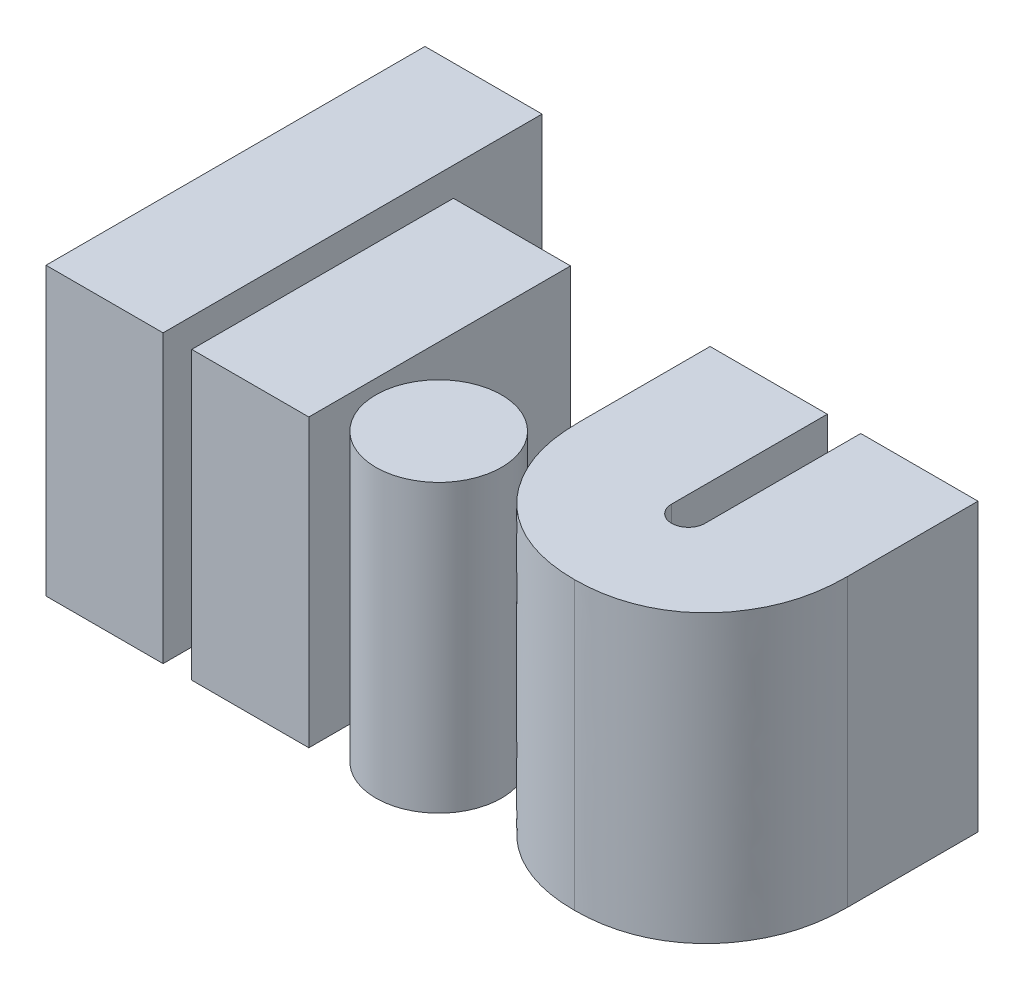
ISO-10303-21;
HEADER;
FILE_DESCRIPTION(('STEP AP214'),'2;1');
FILE_NAME('part.step','',(''),(''),'','','');
FILE_SCHEMA(('AUTOMOTIVE_DESIGN { 1 0 10303 214 1 1 1 1 }'));
ENDSEC;
DATA;
#1=APPLICATION_CONTEXT('core data for automotive mechanical design processes');
#2=APPLICATION_PROTOCOL_DEFINITION('international standard','automotive_design',2000,#1);
#3=PRODUCT_CONTEXT('',#1,'mechanical');
#4=PRODUCT('Part','Part','',(#3));
#5=PRODUCT_RELATED_PRODUCT_CATEGORY('part','',(#4));
#6=PRODUCT_DEFINITION_FORMATION('','',#4);
#7=PRODUCT_DEFINITION_CONTEXT('part definition',#1,'design');
#8=PRODUCT_DEFINITION('design','',#6,#7);
#9=PRODUCT_DEFINITION_SHAPE('','',#8);
#10=(LENGTH_UNIT() NAMED_UNIT(*) SI_UNIT(.MILLI.,.METRE.));
#11=(NAMED_UNIT(*) PLANE_ANGLE_UNIT() SI_UNIT($,.RADIAN.));
#12=(NAMED_UNIT(*) SI_UNIT($,.STERADIAN.) SOLID_ANGLE_UNIT());
#13=UNCERTAINTY_MEASURE_WITH_UNIT(LENGTH_MEASURE(1.E-05),#10,'distance_accuracy_value','');
#14=(GEOMETRIC_REPRESENTATION_CONTEXT(3) GLOBAL_UNCERTAINTY_ASSIGNED_CONTEXT((#13)) GLOBAL_UNIT_ASSIGNED_CONTEXT((#10,
#11,#12)) REPRESENTATION_CONTEXT('',''));
#15=CARTESIAN_POINT('',(0.,0.,0.));
#16=DIRECTION('',(0.,0.,1.));
#17=DIRECTION('',(1.,0.,0.));
#18=AXIS2_PLACEMENT_3D('',#15,#16,#17);
#19=CARTESIAN_POINT('',(2106.66306694249,1500.,0.));
#20=DIRECTION('',(-1.,0.,0.));
#21=DIRECTION('',(0.,0.,1.));
#22=AXIS2_PLACEMENT_3D('',#19,#20,#21);
#23=PLANE('',#22);
#24=DIRECTION('',(0.,0.,-1.));
#25=VECTOR('',#24,1.);
#26=CARTESIAN_POINT('',(2106.66306694249,0.,0.));
#27=LINE('',#26,#25);
#28=CARTESIAN_POINT('',(2106.66306694249,0.,-685.733409360212));
#29=VERTEX_POINT('',#28);
#30=CARTESIAN_POINT('',(2106.66306694249,0.,-1370.));
#31=VERTEX_POINT('',#30);
#32=EDGE_CURVE('E197',#29,#31,#27,.T.);
#33=ORIENTED_EDGE('',*,*,#32,.F.);
#34=DIRECTION('',(0.,-1.,0.));
#35=VECTOR('',#34,1.);
#36=CARTESIAN_POINT('',(2106.66306694249,1500.,-685.733409360212));
#37=LINE('',#36,#35);
#38=CARTESIAN_POINT('',(2106.66306694249,1500.,-685.733409360212));
#39=VERTEX_POINT('',#38);
#40=EDGE_CURVE('E13',#39,#29,#37,.T.);
#41=ORIENTED_EDGE('',*,*,#40,.F.);
#42=DIRECTION('',(0.,0.,-1.));
#43=VECTOR('',#42,1.);
#44=CARTESIAN_POINT('',(2106.66306694249,1500.,0.));
#45=LINE('',#44,#43);
#46=CARTESIAN_POINT('',(2106.66306694249,1500.,-1370.));
#47=VERTEX_POINT('',#46);
#48=EDGE_CURVE('E236',#39,#47,#45,.T.);
#49=ORIENTED_EDGE('',*,*,#48,.T.);
#50=DIRECTION('',(0.,-1.,0.));
#51=VECTOR('',#50,1.);
#52=CARTESIAN_POINT('',(2106.66306694249,1500.,-1370.));
#53=LINE('',#52,#51);
#54=EDGE_CURVE('E109',#47,#31,#53,.T.);
#55=ORIENTED_EDGE('',*,*,#54,.T.);
#56=EDGE_LOOP('',(#33,#41,#49,#55));
#57=FACE_BOUND('',#56,.T.);
#58=ADVANCED_FACE('F92',(#57),#23,.T.);
#59=CARTESIAN_POINT('',(2106.66306694249,1500.,-685.733409360212));
#60=CARTESIAN_POINT('',(2106.66306694249,1500.,-474.521967782166));
#61=CARTESIAN_POINT('',(2181.19768173212,1500.,-320.48830159441));
#62=CARTESIAN_POINT('',(2303.26465584243,1500.,-147.729761618294));
#63=CARTESIAN_POINT('',(2507.17194734234,1500.,42.0000000000477));
#64=CARTESIAN_POINT('',(2808.00000000001,1500.,41.9999999999999));
#65=B_SPLINE_CURVE_WITH_KNOTS('',3,(#59,#60,#61,#62,#63,#64),.UNSPECIFIED.,.F.,.F.,(4,1,1,4),
(0.,0.501134505368616,0.601134505368616,1.),.UNSPECIFIED.);
#66=DIRECTION('',(0.,-1.,0.));
#67=VECTOR('',#66,1.);
#68=SURFACE_OF_LINEAR_EXTRUSION('',#65,#67);
#69=CARTESIAN_POINT('',(2106.66306694249,0.,-685.733409360212));
#70=CARTESIAN_POINT('',(2106.66306694249,0.,-474.521967782166));
#71=CARTESIAN_POINT('',(2181.19768173212,0.,-320.48830159441));
#72=CARTESIAN_POINT('',(2303.26465584243,0.,-147.729761618294));
#73=CARTESIAN_POINT('',(2507.17194734234,0.,42.0000000000477));
#74=CARTESIAN_POINT('',(2808.00000000001,0.,41.9999999999999));
#75=B_SPLINE_CURVE_WITH_KNOTS('',3,(#69,#70,#71,#72,#73,#74),.UNSPECIFIED.,.F.,.F.,(4,1,1,4),
(0.,0.501134505368616,0.601134505368616,1.),.UNSPECIFIED.);
#76=CARTESIAN_POINT('',(2807.99999999999,0.,41.9999999999999));
#77=VERTEX_POINT('',#76);
#78=EDGE_CURVE('E200',#29,#77,#75,.T.);
#79=ORIENTED_EDGE('',*,*,#78,.T.);
#80=DIRECTION('',(0.,-1.,0.));
#81=VECTOR('',#80,1.);
#82=CARTESIAN_POINT('',(2807.99999999999,1500.,41.9999999999999));
#83=LINE('',#82,#81);
#84=CARTESIAN_POINT('',(2807.99999999999,1500.,41.9999999999999));
#85=VERTEX_POINT('',#84);
#86=EDGE_CURVE('E101',#85,#77,#83,.T.);
#87=ORIENTED_EDGE('',*,*,#86,.F.);
#88=EDGE_CURVE('E290',#39,#85,#65,.T.);
#89=ORIENTED_EDGE('',*,*,#88,.F.);
#90=ORIENTED_EDGE('',*,*,#40,.T.);
#91=EDGE_LOOP('',(#79,#87,#89,#90));
#92=FACE_BOUND('',#91,.T.);
#93=ADVANCED_FACE('F263',(#92),#68,.F.);
#94=CARTESIAN_POINT('',(3509.33693305751,1500.,-685.733409360212));
#95=CARTESIAN_POINT('',(3509.33693305751,1500.,-474.521967782166));
#96=CARTESIAN_POINT('',(3434.80231826788,1500.,-320.48830159441));
#97=CARTESIAN_POINT('',(3312.73534415757,1500.,-147.729761618294));
#98=CARTESIAN_POINT('',(3108.82805265766,1500.,42.0000000000477));
#99=CARTESIAN_POINT('',(2807.99999999999,1500.,41.9999999999999));
#100=B_SPLINE_CURVE_WITH_KNOTS('',3,(#94,#95,#96,#97,#98,#99),.UNSPECIFIED.,.F.,.F.,(4,1,1,4),
(0.,0.501134505368616,0.601134505368616,1.),.UNSPECIFIED.);
#101=DIRECTION('',(0.,-1.,0.));
#102=VECTOR('',#101,1.);
#103=SURFACE_OF_LINEAR_EXTRUSION('',#100,#102);
#104=CARTESIAN_POINT('',(3509.33693305751,0.,-685.733409360212));
#105=CARTESIAN_POINT('',(3509.33693305751,0.,-474.521967782166));
#106=CARTESIAN_POINT('',(3434.80231826788,0.,-320.48830159441));
#107=CARTESIAN_POINT('',(3312.73534415757,0.,-147.729761618294));
#108=CARTESIAN_POINT('',(3108.82805265766,0.,42.0000000000477));
#109=CARTESIAN_POINT('',(2807.99999999999,0.,41.9999999999999));
#110=B_SPLINE_CURVE_WITH_KNOTS('',3,(#104,#105,#106,#107,#108,#109),.UNSPECIFIED.,.F.,.F.,(4,1,
1,4),(0.,0.501134505368616,0.601134505368616,1.),.UNSPECIFIED.);
#111=CARTESIAN_POINT('',(3509.33693305751,0.,-685.733409360212));
#112=VERTEX_POINT('',#111);
#113=EDGE_CURVE('E206',#112,#77,#110,.T.);
#114=ORIENTED_EDGE('',*,*,#113,.F.);
#115=DIRECTION('',(0.,-1.,0.));
#116=VECTOR('',#115,1.);
#117=CARTESIAN_POINT('',(3509.33693305751,1500.,-685.733409360212));
#118=LINE('',#117,#116);
#119=CARTESIAN_POINT('',(3509.33693305751,1500.,-685.733409360212));
#120=VERTEX_POINT('',#119);
#121=EDGE_CURVE('E251',#120,#112,#118,.T.);
#122=ORIENTED_EDGE('',*,*,#121,.F.);
#123=EDGE_CURVE('E260',#120,#85,#100,.T.);
#124=ORIENTED_EDGE('',*,*,#123,.T.);
#125=ORIENTED_EDGE('',*,*,#86,.T.);
#126=EDGE_LOOP('',(#114,#122,#124,#125));
#127=FACE_BOUND('',#126,.T.);
#128=ADVANCED_FACE('F258',(#127),#103,.T.);
#129=CARTESIAN_POINT('',(3509.33693305751,1500.,0.));
#130=DIRECTION('',(-1.,0.,0.));
#131=DIRECTION('',(0.,0.,1.));
#132=AXIS2_PLACEMENT_3D('',#129,#130,#131);
#133=PLANE('',#132);
#134=DIRECTION('',(0.,0.,-1.));
#135=VECTOR('',#134,1.);
#136=CARTESIAN_POINT('',(3509.33693305751,0.,0.));
#137=LINE('',#136,#135);
#138=CARTESIAN_POINT('',(3509.33693305751,0.,-1370.));
#139=VERTEX_POINT('',#138);
#140=EDGE_CURVE('E215',#112,#139,#137,.T.);
#141=ORIENTED_EDGE('',*,*,#140,.T.);
#142=DIRECTION('',(0.,-1.,0.));
#143=VECTOR('',#142,1.);
#144=CARTESIAN_POINT('',(3509.33693305751,1500.,-1370.));
#145=LINE('',#144,#143);
#146=CARTESIAN_POINT('',(3509.33693305751,1500.,-1370.));
#147=VERTEX_POINT('',#146);
#148=EDGE_CURVE('E247',#147,#139,#145,.T.);
#149=ORIENTED_EDGE('',*,*,#148,.F.);
#150=DIRECTION('',(0.,0.,-1.));
#151=VECTOR('',#150,1.);
#152=CARTESIAN_POINT('',(3509.33693305751,1500.,0.));
#153=LINE('',#152,#151);
#154=EDGE_CURVE('E279',#120,#147,#153,.T.);
#155=ORIENTED_EDGE('',*,*,#154,.F.);
#156=ORIENTED_EDGE('',*,*,#121,.T.);
#157=EDGE_LOOP('',(#141,#149,#155,#156));
#158=FACE_BOUND('',#157,.T.);
#159=ADVANCED_FACE('F271',(#158),#133,.F.);
#160=CARTESIAN_POINT('',(0.,1500.,-1370.));
#161=DIRECTION('',(0.,0.,1.));
#162=DIRECTION('',(1.,0.,0.));
#163=AXIS2_PLACEMENT_3D('',#160,#161,#162);
#164=PLANE('',#163);
#165=DIRECTION('',(-1.,0.,0.));
#166=VECTOR('',#165,1.);
#167=CARTESIAN_POINT('',(0.,0.,-1370.));
#168=LINE('',#167,#166);
#169=CARTESIAN_POINT('',(2895.5,0.,-1370.));
#170=VERTEX_POINT('',#169);
#171=EDGE_CURVE('E221',#139,#170,#168,.T.);
#172=ORIENTED_EDGE('',*,*,#171,.T.);
#173=DIRECTION('',(0.,-1.,0.));
#174=VECTOR('',#173,1.);
#175=CARTESIAN_POINT('',(2895.5,1500.,-1370.));
#176=LINE('',#175,#174);
#177=CARTESIAN_POINT('',(2895.5,1500.,-1370.));
#178=VERTEX_POINT('',#177);
#179=EDGE_CURVE('E243',#178,#170,#176,.T.);
#180=ORIENTED_EDGE('',*,*,#179,.F.);
#181=DIRECTION('',(-1.,0.,0.));
#182=VECTOR('',#181,1.);
#183=CARTESIAN_POINT('',(0.,1500.,-1370.));
#184=LINE('',#183,#182);
#185=EDGE_CURVE('E277',#147,#178,#184,.T.);
#186=ORIENTED_EDGE('',*,*,#185,.F.);
#187=ORIENTED_EDGE('',*,*,#148,.T.);
#188=EDGE_LOOP('',(#172,#180,#186,#187));
#189=FACE_BOUND('',#188,.T.);
#190=ADVANCED_FACE('F275',(#189),#164,.F.);
#191=CARTESIAN_POINT('',(2895.5,1500.,0.));
#192=DIRECTION('',(1.,0.,0.));
#193=DIRECTION('',(0.,0.,-1.));
#194=AXIS2_PLACEMENT_3D('',#191,#192,#193);
#195=PLANE('',#194);
#196=DIRECTION('',(0.,0.,1.));
#197=VECTOR('',#196,1.);
#198=CARTESIAN_POINT('',(2895.5,0.,0.));
#199=LINE('',#198,#197);
#200=CARTESIAN_POINT('',(2895.5,0.,-554.839793383717));
#201=VERTEX_POINT('',#200);
#202=EDGE_CURVE('E224',#170,#201,#199,.T.);
#203=ORIENTED_EDGE('',*,*,#202,.T.);
#204=DIRECTION('',(0.,-1.,0.));
#205=VECTOR('',#204,1.);
#206=CARTESIAN_POINT('',(2895.5,1500.,-554.839793383717));
#207=LINE('',#206,#205);
#208=CARTESIAN_POINT('',(2895.5,1500.,-554.839793383717));
#209=VERTEX_POINT('',#208);
#210=EDGE_CURVE('E187',#209,#201,#207,.T.);
#211=ORIENTED_EDGE('',*,*,#210,.F.);
#212=DIRECTION('',(0.,0.,1.));
#213=VECTOR('',#212,1.);
#214=CARTESIAN_POINT('',(2895.5,1500.,0.));
#215=LINE('',#214,#213);
#216=EDGE_CURVE('E173',#178,#209,#215,.T.);
#217=ORIENTED_EDGE('',*,*,#216,.F.);
#218=ORIENTED_EDGE('',*,*,#179,.T.);
#219=EDGE_LOOP('',(#203,#211,#217,#218));
#220=FACE_BOUND('',#219,.T.);
#221=ADVANCED_FACE('F321',(#220),#195,.F.);
#222=CARTESIAN_POINT('',(2808.,1500.,-554.839793383717));
#223=DIRECTION('',(0.,-1.,0.));
#224=DIRECTION('',(0.,0.,-1.));
#225=AXIS2_PLACEMENT_3D('',#222,#223,#224);
#226=CYLINDRICAL_SURFACE('',#225,87.5000000000004);
#227=CARTESIAN_POINT('',(2808.,0.,-554.839793383717));
#228=DIRECTION('',(0.,1.,0.));
#229=DIRECTION('',(0.,0.,1.));
#230=AXIS2_PLACEMENT_3D('',#227,#228,#229);
#231=CIRCLE('',#230,87.5000000000004);
#232=CARTESIAN_POINT('',(2720.5,0.,-554.839793383717));
#233=VERTEX_POINT('',#232);
#234=EDGE_CURVE('E183',#201,#233,#231,.F.);
#235=ORIENTED_EDGE('',*,*,#234,.T.);
#236=DIRECTION('',(0.,-1.,0.));
#237=VECTOR('',#236,1.);
#238=CARTESIAN_POINT('',(2720.5,1500.,-554.839793383717));
#239=LINE('',#238,#237);
#240=CARTESIAN_POINT('',(2720.5,1500.,-554.839793383717));
#241=VERTEX_POINT('',#240);
#242=EDGE_CURVE('E180',#241,#233,#239,.T.);
#243=ORIENTED_EDGE('',*,*,#242,.F.);
#244=CARTESIAN_POINT('',(2808.,1500.,-554.839793383717));
#245=DIRECTION('',(0.,1.,0.));
#246=DIRECTION('',(0.,0.,1.));
#247=AXIS2_PLACEMENT_3D('',#244,#245,#246);
#248=CIRCLE('',#247,87.5000000000004);
#249=EDGE_CURVE('E165',#209,#241,#248,.F.);
#250=ORIENTED_EDGE('',*,*,#249,.F.);
#251=ORIENTED_EDGE('',*,*,#210,.T.);
#252=EDGE_LOOP('',(#235,#243,#250,#251));
#253=FACE_BOUND('',#252,.T.);
#254=ADVANCED_FACE('F181',(#253),#226,.F.);
#255=CARTESIAN_POINT('',(2720.5,1500.,0.));
#256=DIRECTION('',(1.,0.,0.));
#257=DIRECTION('',(0.,0.,-1.));
#258=AXIS2_PLACEMENT_3D('',#255,#256,#257);
#259=PLANE('',#258);
#260=DIRECTION('',(0.,0.,1.));
#261=VECTOR('',#260,1.);
#262=CARTESIAN_POINT('',(2720.5,0.,0.));
#263=LINE('',#262,#261);
#264=CARTESIAN_POINT('',(2720.5,0.,-1370.));
#265=VERTEX_POINT('',#264);
#266=EDGE_CURVE('E229',#265,#233,#263,.T.);
#267=ORIENTED_EDGE('',*,*,#266,.F.);
#268=DIRECTION('',(0.,-1.,0.));
#269=VECTOR('',#268,1.);
#270=CARTESIAN_POINT('',(2720.5,1500.,-1370.));
#271=LINE('',#270,#269);
#272=CARTESIAN_POINT('',(2720.5,1500.,-1370.));
#273=VERTEX_POINT('',#272);
#274=EDGE_CURVE('E137',#273,#265,#271,.T.);
#275=ORIENTED_EDGE('',*,*,#274,.F.);
#276=DIRECTION('',(0.,0.,1.));
#277=VECTOR('',#276,1.);
#278=CARTESIAN_POINT('',(2720.5,1500.,0.));
#279=LINE('',#278,#277);
#280=EDGE_CURVE('E171',#273,#241,#279,.T.);
#281=ORIENTED_EDGE('',*,*,#280,.T.);
#282=ORIENTED_EDGE('',*,*,#242,.T.);
#283=EDGE_LOOP('',(#267,#275,#281,#282));
#284=FACE_BOUND('',#283,.T.);
#285=ADVANCED_FACE('F189',(#284),#259,.T.);
#286=CARTESIAN_POINT('',(0.,1500.,-1370.));
#287=DIRECTION('',(0.,0.,-1.));
#288=DIRECTION('',(-1.,0.,0.));
#289=AXIS2_PLACEMENT_3D('',#286,#287,#288);
#290=PLANE('',#289);
#291=DIRECTION('',(1.,0.,0.));
#292=VECTOR('',#291,1.);
#293=CARTESIAN_POINT('',(0.,0.,-1370.));
#294=LINE('',#293,#292);
#295=EDGE_CURVE('E232',#31,#265,#294,.T.);
#296=ORIENTED_EDGE('',*,*,#295,.F.);
#297=ORIENTED_EDGE('',*,*,#54,.F.);
#298=DIRECTION('',(1.,0.,0.));
#299=VECTOR('',#298,1.);
#300=CARTESIAN_POINT('',(0.,1500.,-1370.));
#301=LINE('',#300,#299);
#302=EDGE_CURVE('E191',#47,#273,#301,.T.);
#303=ORIENTED_EDGE('',*,*,#302,.T.);
#304=ORIENTED_EDGE('',*,*,#274,.T.);
#305=EDGE_LOOP('',(#296,#297,#303,#304));
#306=FACE_BOUND('',#305,.T.);
#307=ADVANCED_FACE('F308',(#306),#290,.T.);
#308=CARTESIAN_POINT('',(0.,1500.,0.));
#309=DIRECTION('',(0.,1.,0.));
#310=DIRECTION('',(0.,0.,1.));
#311=AXIS2_PLACEMENT_3D('',#308,#309,#310);
#312=PLANE('',#311);
#313=ORIENTED_EDGE('',*,*,#48,.F.);
#314=ORIENTED_EDGE('',*,*,#88,.T.);
#315=ORIENTED_EDGE('',*,*,#123,.F.);
#316=ORIENTED_EDGE('',*,*,#154,.T.);
#317=ORIENTED_EDGE('',*,*,#185,.T.);
#318=ORIENTED_EDGE('',*,*,#216,.T.);
#319=ORIENTED_EDGE('',*,*,#249,.T.);
#320=ORIENTED_EDGE('',*,*,#280,.F.);
#321=ORIENTED_EDGE('',*,*,#302,.F.);
#322=EDGE_LOOP('',(#313,#314,#315,#316,#317,#318,#319,#320,#321));
#323=FACE_BOUND('',#322,.T.);
#324=ADVANCED_FACE('F168',(#323),#312,.T.);
#325=CARTESIAN_POINT('',(0.,0.,0.));
#326=DIRECTION('',(0.,1.,0.));
#327=DIRECTION('',(0.,0.,1.));
#328=AXIS2_PLACEMENT_3D('',#325,#326,#327);
#329=PLANE('',#328);
#330=ORIENTED_EDGE('',*,*,#32,.T.);
#331=ORIENTED_EDGE('',*,*,#295,.T.);
#332=ORIENTED_EDGE('',*,*,#266,.T.);
#333=ORIENTED_EDGE('',*,*,#234,.F.);
#334=ORIENTED_EDGE('',*,*,#202,.F.);
#335=ORIENTED_EDGE('',*,*,#171,.F.);
#336=ORIENTED_EDGE('',*,*,#140,.F.);
#337=ORIENTED_EDGE('',*,*,#113,.T.);
#338=ORIENTED_EDGE('',*,*,#78,.F.);
#339=EDGE_LOOP('',(#330,#331,#332,#333,#334,#335,#336,#337,#338));
#340=FACE_BOUND('',#339,.T.);
#341=ADVANCED_FACE('F266',(#340),#329,.F.);
#342=CLOSED_SHELL('',(#58,#93,#128,#159,#190,#221,#254,#285,#307,#324,#341));
#343=MANIFOLD_SOLID_BREP('B2',#342);
#344=CARTESIAN_POINT('',(1780.,1500.,-276.));
#345=DIRECTION('',(0.,-1.,0.));
#346=DIRECTION('',(0.,0.,-1.));
#347=AXIS2_PLACEMENT_3D('',#344,#345,#346);
#348=CYLINDRICAL_SURFACE('',#347,329.);
#349=CARTESIAN_POINT('',(1780.,1500.,-276.));
#350=DIRECTION('',(0.,1.,0.));
#351=DIRECTION('',(0.,0.,1.));
#352=AXIS2_PLACEMENT_3D('',#349,#350,#351);
#353=CIRCLE('',#352,329.);
#354=CARTESIAN_POINT('',(1780.,1500.,53.0000000000003));
#355=VERTEX_POINT('',#354);
#356=EDGE_CURVE('E91',#355,#355,#353,.T.);
#357=ORIENTED_EDGE('',*,*,#356,.F.);
#358=EDGE_LOOP('',(#357));
#359=FACE_BOUND('',#358,.T.);
#360=CARTESIAN_POINT('',(1780.,0.,-276.));
#361=DIRECTION('',(0.,1.,0.));
#362=DIRECTION('',(0.,0.,1.));
#363=AXIS2_PLACEMENT_3D('',#360,#361,#362);
#364=CIRCLE('',#363,329.);
#365=CARTESIAN_POINT('',(1780.,0.,53.0000000000003));
#366=VERTEX_POINT('',#365);
#367=EDGE_CURVE('E430',#366,#366,#364,.T.);
#368=ORIENTED_EDGE('',*,*,#367,.T.);
#369=EDGE_LOOP('',(#368));
#370=FACE_BOUND('',#369,.T.);
#371=ADVANCED_FACE('F427',(#359,#370),#348,.T.);
#372=CARTESIAN_POINT('',(0.,1500.,0.));
#373=DIRECTION('',(0.,1.,0.));
#374=DIRECTION('',(0.,0.,1.));
#375=AXIS2_PLACEMENT_3D('',#372,#373,#374);
#376=PLANE('',#375);
#377=ORIENTED_EDGE('',*,*,#356,.T.);
#378=EDGE_LOOP('',(#377));
#379=FACE_BOUND('',#378,.T.);
#380=ADVANCED_FACE('F442',(#379),#376,.T.);
#381=CARTESIAN_POINT('',(0.,0.,0.));
#382=DIRECTION('',(0.,1.,0.));
#383=DIRECTION('',(0.,0.,1.));
#384=AXIS2_PLACEMENT_3D('',#381,#382,#383);
#385=PLANE('',#384);
#386=ORIENTED_EDGE('',*,*,#367,.F.);
#387=EDGE_LOOP('',(#386));
#388=FACE_BOUND('',#387,.T.);
#389=ADVANCED_FACE('F440',(#388),#385,.F.);
#390=CLOSED_SHELL('',(#371,#380,#389));
#391=MANIFOLD_SOLID_BREP('B7',#390);
#392=CARTESIAN_POINT('',(0.,1500.,0.));
#393=DIRECTION('',(0.,0.,-1.));
#394=DIRECTION('',(-1.,0.,0.));
#395=AXIS2_PLACEMENT_3D('',#392,#393,#394);
#396=PLANE('',#395);
#397=DIRECTION('',(1.,0.,0.));
#398=VECTOR('',#397,1.);
#399=CARTESIAN_POINT('',(0.,0.,0.));
#400=LINE('',#399,#398);
#401=CARTESIAN_POINT('',(763.,0.,0.));
#402=VERTEX_POINT('',#401);
#403=CARTESIAN_POINT('',(1376.,0.,0.));
#404=VERTEX_POINT('',#403);
#405=EDGE_CURVE('E546',#402,#404,#400,.T.);
#406=ORIENTED_EDGE('',*,*,#405,.T.);
#407=DIRECTION('',(0.,-1.,0.));
#408=VECTOR('',#407,1.);
#409=CARTESIAN_POINT('',(1376.,1500.,0.));
#410=LINE('',#409,#408);
#411=CARTESIAN_POINT('',(1376.,1500.,0.));
#412=VERTEX_POINT('',#411);
#413=EDGE_CURVE('E425',#412,#404,#410,.T.);
#414=ORIENTED_EDGE('',*,*,#413,.F.);
#415=DIRECTION('',(1.,0.,0.));
#416=VECTOR('',#415,1.);
#417=CARTESIAN_POINT('',(0.,1500.,0.));
#418=LINE('',#417,#416);
#419=CARTESIAN_POINT('',(763.,1500.,0.));
#420=VERTEX_POINT('',#419);
#421=EDGE_CURVE('E532',#420,#412,#418,.T.);
#422=ORIENTED_EDGE('',*,*,#421,.F.);
#423=DIRECTION('',(0.,-1.,0.));
#424=VECTOR('',#423,1.);
#425=CARTESIAN_POINT('',(763.,1500.,0.));
#426=LINE('',#425,#424);
#427=EDGE_CURVE('E499',#420,#402,#426,.T.);
#428=ORIENTED_EDGE('',*,*,#427,.T.);
#429=EDGE_LOOP('',(#406,#414,#422,#428));
#430=FACE_BOUND('',#429,.T.);
#431=ADVANCED_FACE('F483',(#430),#396,.F.);
#432=CARTESIAN_POINT('',(1376.,1500.,0.));
#433=DIRECTION('',(-1.,0.,0.));
#434=DIRECTION('',(0.,0.,1.));
#435=AXIS2_PLACEMENT_3D('',#432,#433,#434);
#436=PLANE('',#435);
#437=DIRECTION('',(0.,0.,-1.));
#438=VECTOR('',#437,1.);
#439=CARTESIAN_POINT('',(1376.,0.,0.));
#440=LINE('',#439,#438);
#441=CARTESIAN_POINT('',(1376.,0.,-1370.));
#442=VERTEX_POINT('',#441);
#443=EDGE_CURVE('E537',#404,#442,#440,.T.);
#444=ORIENTED_EDGE('',*,*,#443,.T.);
#445=DIRECTION('',(0.,-1.,0.));
#446=VECTOR('',#445,1.);
#447=CARTESIAN_POINT('',(1376.,1500.,-1370.));
#448=LINE('',#447,#446);
#449=CARTESIAN_POINT('',(1376.,1500.,-1370.));
#450=VERTEX_POINT('',#449);
#451=EDGE_CURVE('E491',#450,#442,#448,.T.);
#452=ORIENTED_EDGE('',*,*,#451,.F.);
#453=DIRECTION('',(0.,0.,-1.));
#454=VECTOR('',#453,1.);
#455=CARTESIAN_POINT('',(1376.,1500.,0.));
#456=LINE('',#455,#454);
#457=EDGE_CURVE('E524',#412,#450,#456,.T.);
#458=ORIENTED_EDGE('',*,*,#457,.F.);
#459=ORIENTED_EDGE('',*,*,#413,.T.);
#460=EDGE_LOOP('',(#444,#452,#458,#459));
#461=FACE_BOUND('',#460,.T.);
#462=ADVANCED_FACE('F536',(#461),#436,.F.);
#463=CARTESIAN_POINT('',(0.,1500.,-1370.));
#464=DIRECTION('',(0.,0.,-1.));
#465=DIRECTION('',(-1.,0.,0.));
#466=AXIS2_PLACEMENT_3D('',#463,#464,#465);
#467=PLANE('',#466);
#468=DIRECTION('',(1.,0.,0.));
#469=VECTOR('',#468,1.);
#470=CARTESIAN_POINT('',(0.,0.,-1370.));
#471=LINE('',#470,#469);
#472=CARTESIAN_POINT('',(763.,0.,-1370.));
#473=VERTEX_POINT('',#472);
#474=EDGE_CURVE('E549',#473,#442,#471,.T.);
#475=ORIENTED_EDGE('',*,*,#474,.F.);
#476=DIRECTION('',(0.,-1.,0.));
#477=VECTOR('',#476,1.);
#478=CARTESIAN_POINT('',(763.,1500.,-1370.));
#479=LINE('',#478,#477);
#480=CARTESIAN_POINT('',(763.,1500.,-1370.));
#481=VERTEX_POINT('',#480);
#482=EDGE_CURVE('E513',#481,#473,#479,.T.);
#483=ORIENTED_EDGE('',*,*,#482,.F.);
#484=DIRECTION('',(1.,0.,0.));
#485=VECTOR('',#484,1.);
#486=CARTESIAN_POINT('',(0.,1500.,-1370.));
#487=LINE('',#486,#485);
#488=EDGE_CURVE('E531',#481,#450,#487,.T.);
#489=ORIENTED_EDGE('',*,*,#488,.T.);
#490=ORIENTED_EDGE('',*,*,#451,.T.);
#491=EDGE_LOOP('',(#475,#483,#489,#490));
#492=FACE_BOUND('',#491,.T.);
#493=ADVANCED_FACE('F540',(#492),#467,.T.);
#494=CARTESIAN_POINT('',(763.,1500.,0.));
#495=DIRECTION('',(-1.,0.,0.));
#496=DIRECTION('',(0.,0.,1.));
#497=AXIS2_PLACEMENT_3D('',#494,#495,#496);
#498=PLANE('',#497);
#499=DIRECTION('',(0.,0.,-1.));
#500=VECTOR('',#499,1.);
#501=CARTESIAN_POINT('',(763.,0.,0.));
#502=LINE('',#501,#500);
#503=EDGE_CURVE('E551',#402,#473,#502,.T.);
#504=ORIENTED_EDGE('',*,*,#503,.F.);
#505=ORIENTED_EDGE('',*,*,#427,.F.);
#506=DIRECTION('',(0.,0.,-1.));
#507=VECTOR('',#506,1.);
#508=CARTESIAN_POINT('',(763.,1500.,0.));
#509=LINE('',#508,#507);
#510=EDGE_CURVE('E541',#420,#481,#509,.T.);
#511=ORIENTED_EDGE('',*,*,#510,.T.);
#512=ORIENTED_EDGE('',*,*,#482,.T.);
#513=EDGE_LOOP('',(#504,#505,#511,#512));
#514=FACE_BOUND('',#513,.T.);
#515=ADVANCED_FACE('F557',(#514),#498,.T.);
#516=CARTESIAN_POINT('',(0.,1500.,0.));
#517=DIRECTION('',(0.,1.,0.));
#518=DIRECTION('',(0.,0.,1.));
#519=AXIS2_PLACEMENT_3D('',#516,#517,#518);
#520=PLANE('',#519);
#521=ORIENTED_EDGE('',*,*,#421,.T.);
#522=ORIENTED_EDGE('',*,*,#457,.T.);
#523=ORIENTED_EDGE('',*,*,#488,.F.);
#524=ORIENTED_EDGE('',*,*,#510,.F.);
#525=EDGE_LOOP('',(#521,#522,#523,#524));
#526=FACE_BOUND('',#525,.T.);
#527=ADVANCED_FACE('F528',(#526),#520,.T.);
#528=CARTESIAN_POINT('',(0.,0.,0.));
#529=DIRECTION('',(0.,1.,0.));
#530=DIRECTION('',(0.,0.,1.));
#531=AXIS2_PLACEMENT_3D('',#528,#529,#530);
#532=PLANE('',#531);
#533=ORIENTED_EDGE('',*,*,#405,.F.);
#534=ORIENTED_EDGE('',*,*,#503,.T.);
#535=ORIENTED_EDGE('',*,*,#474,.T.);
#536=ORIENTED_EDGE('',*,*,#443,.F.);
#537=EDGE_LOOP('',(#533,#534,#535,#536));
#538=FACE_BOUND('',#537,.T.);
#539=ADVANCED_FACE('F556',(#538),#532,.F.);
#540=CLOSED_SHELL('',(#431,#462,#493,#515,#527,#539));
#541=MANIFOLD_SOLID_BREP('B86',#540);
#542=CARTESIAN_POINT('',(0.,1500.,0.));
#543=DIRECTION('',(0.,0.,-1.));
#544=DIRECTION('',(-1.,0.,0.));
#545=AXIS2_PLACEMENT_3D('',#542,#543,#544);
#546=PLANE('',#545);
#547=DIRECTION('',(1.,0.,0.));
#548=VECTOR('',#547,1.);
#549=CARTESIAN_POINT('',(0.,0.,0.));
#550=LINE('',#549,#548);
#551=CARTESIAN_POINT('',(0.,0.,0.));
#552=VERTEX_POINT('',#551);
#553=CARTESIAN_POINT('',(613.,0.,0.));
#554=VERTEX_POINT('',#553);
#555=EDGE_CURVE('E682',#552,#554,#550,.T.);
#556=ORIENTED_EDGE('',*,*,#555,.T.);
#557=DIRECTION('',(0.,-1.,0.));
#558=VECTOR('',#557,1.);
#559=CARTESIAN_POINT('',(613.,1500.,0.));
#560=LINE('',#559,#558);
#561=CARTESIAN_POINT('',(613.,1500.,0.));
#562=VERTEX_POINT('',#561);
#563=EDGE_CURVE('E481',#562,#554,#560,.T.);
#564=ORIENTED_EDGE('',*,*,#563,.F.);
#565=DIRECTION('',(1.,0.,0.));
#566=VECTOR('',#565,1.);
#567=CARTESIAN_POINT('',(0.,1500.,0.));
#568=LINE('',#567,#566);
#569=CARTESIAN_POINT('',(0.,1500.,0.));
#570=VERTEX_POINT('',#569);
#571=EDGE_CURVE('E668',#570,#562,#568,.T.);
#572=ORIENTED_EDGE('',*,*,#571,.F.);
#573=DIRECTION('',(0.,-1.,0.));
#574=VECTOR('',#573,1.);
#575=CARTESIAN_POINT('',(0.,1500.,0.));
#576=LINE('',#575,#574);
#577=EDGE_CURVE('E635',#570,#552,#576,.T.);
#578=ORIENTED_EDGE('',*,*,#577,.T.);
#579=EDGE_LOOP('',(#556,#564,#572,#578));
#580=FACE_BOUND('',#579,.T.);
#581=ADVANCED_FACE('F619',(#580),#546,.F.);
#582=CARTESIAN_POINT('',(613.,1500.,-1.37211031067585E-13));
#583=DIRECTION('',(-1.,0.,0.));
#584=DIRECTION('',(0.,0.,1.));
#585=AXIS2_PLACEMENT_3D('',#582,#583,#584);
#586=PLANE('',#585);
#587=DIRECTION('',(0.,0.,-1.));
#588=VECTOR('',#587,1.);
#589=CARTESIAN_POINT('',(613.,0.,-1.37211031067585E-13));
#590=LINE('',#589,#588);
#591=CARTESIAN_POINT('',(613.,0.,-1984.));
#592=VERTEX_POINT('',#591);
#593=EDGE_CURVE('E673',#554,#592,#590,.T.);
#594=ORIENTED_EDGE('',*,*,#593,.T.);
#595=DIRECTION('',(0.,-1.,0.));
#596=VECTOR('',#595,1.);
#597=CARTESIAN_POINT('',(613.,1500.,-1984.));
#598=LINE('',#597,#596);
#599=CARTESIAN_POINT('',(613.,1500.,-1984.));
#600=VERTEX_POINT('',#599);
#601=EDGE_CURVE('E627',#600,#592,#598,.T.);
#602=ORIENTED_EDGE('',*,*,#601,.F.);
#603=DIRECTION('',(0.,0.,-1.));
#604=VECTOR('',#603,1.);
#605=CARTESIAN_POINT('',(613.,1500.,-1.37211031067585E-13));
#606=LINE('',#605,#604);
#607=EDGE_CURVE('E660',#562,#600,#606,.T.);
#608=ORIENTED_EDGE('',*,*,#607,.F.);
#609=ORIENTED_EDGE('',*,*,#563,.T.);
#610=EDGE_LOOP('',(#594,#602,#608,#609));
#611=FACE_BOUND('',#610,.T.);
#612=ADVANCED_FACE('F672',(#611),#586,.F.);
#613=CARTESIAN_POINT('',(0.,1500.,-1984.));
#614=DIRECTION('',(0.,0.,-1.));
#615=DIRECTION('',(-1.,0.,0.));
#616=AXIS2_PLACEMENT_3D('',#613,#614,#615);
#617=PLANE('',#616);
#618=DIRECTION('',(1.,0.,0.));
#619=VECTOR('',#618,1.);
#620=CARTESIAN_POINT('',(0.,0.,-1984.));
#621=LINE('',#620,#619);
#622=CARTESIAN_POINT('',(-3.33066907387547E-13,0.,-1984.));
#623=VERTEX_POINT('',#622);
#624=EDGE_CURVE('E685',#623,#592,#621,.T.);
#625=ORIENTED_EDGE('',*,*,#624,.F.);
#626=DIRECTION('',(0.,-1.,0.));
#627=VECTOR('',#626,1.);
#628=CARTESIAN_POINT('',(-3.33066907387547E-13,1500.,-1984.));
#629=LINE('',#628,#627);
#630=CARTESIAN_POINT('',(-3.33066907387547E-13,1500.,-1984.));
#631=VERTEX_POINT('',#630);
#632=EDGE_CURVE('E649',#631,#623,#629,.T.);
#633=ORIENTED_EDGE('',*,*,#632,.F.);
#634=DIRECTION('',(1.,0.,0.));
#635=VECTOR('',#634,1.);
#636=CARTESIAN_POINT('',(0.,1500.,-1984.));
#637=LINE('',#636,#635);
#638=EDGE_CURVE('E667',#631,#600,#637,.T.);
#639=ORIENTED_EDGE('',*,*,#638,.T.);
#640=ORIENTED_EDGE('',*,*,#601,.T.);
#641=EDGE_LOOP('',(#625,#633,#639,#640));
#642=FACE_BOUND('',#641,.T.);
#643=ADVANCED_FACE('F676',(#642),#617,.T.);
#644=CARTESIAN_POINT('',(0.,1500.,0.));
#645=DIRECTION('',(-1.,0.,0.));
#646=DIRECTION('',(0.,0.,1.));
#647=AXIS2_PLACEMENT_3D('',#644,#645,#646);
#648=PLANE('',#647);
#649=DIRECTION('',(0.,0.,-1.));
#650=VECTOR('',#649,1.);
#651=CARTESIAN_POINT('',(0.,0.,0.));
#652=LINE('',#651,#650);
#653=EDGE_CURVE('E687',#552,#623,#652,.T.);
#654=ORIENTED_EDGE('',*,*,#653,.F.);
#655=ORIENTED_EDGE('',*,*,#577,.F.);
#656=DIRECTION('',(0.,0.,-1.));
#657=VECTOR('',#656,1.);
#658=CARTESIAN_POINT('',(0.,1500.,0.));
#659=LINE('',#658,#657);
#660=EDGE_CURVE('E677',#570,#631,#659,.T.);
#661=ORIENTED_EDGE('',*,*,#660,.T.);
#662=ORIENTED_EDGE('',*,*,#632,.T.);
#663=EDGE_LOOP('',(#654,#655,#661,#662));
#664=FACE_BOUND('',#663,.T.);
#665=ADVANCED_FACE('F693',(#664),#648,.T.);
#666=CARTESIAN_POINT('',(0.,1500.,0.));
#667=DIRECTION('',(0.,1.,0.));
#668=DIRECTION('',(0.,0.,1.));
#669=AXIS2_PLACEMENT_3D('',#666,#667,#668);
#670=PLANE('',#669);
#671=ORIENTED_EDGE('',*,*,#571,.T.);
#672=ORIENTED_EDGE('',*,*,#607,.T.);
#673=ORIENTED_EDGE('',*,*,#638,.F.);
#674=ORIENTED_EDGE('',*,*,#660,.F.);
#675=EDGE_LOOP('',(#671,#672,#673,#674));
#676=FACE_BOUND('',#675,.T.);
#677=ADVANCED_FACE('F664',(#676),#670,.T.);
#678=CARTESIAN_POINT('',(0.,0.,0.));
#679=DIRECTION('',(0.,1.,0.));
#680=DIRECTION('',(0.,0.,1.));
#681=AXIS2_PLACEMENT_3D('',#678,#679,#680);
#682=PLANE('',#681);
#683=ORIENTED_EDGE('',*,*,#555,.F.);
#684=ORIENTED_EDGE('',*,*,#653,.T.);
#685=ORIENTED_EDGE('',*,*,#624,.T.);
#686=ORIENTED_EDGE('',*,*,#593,.F.);
#687=EDGE_LOOP('',(#683,#684,#685,#686));
#688=FACE_BOUND('',#687,.T.);
#689=ADVANCED_FACE('F692',(#688),#682,.F.);
#690=CLOSED_SHELL('',(#581,#612,#643,#665,#677,#689));
#691=MANIFOLD_SOLID_BREP('B419',#690);
#692=ADVANCED_BREP_SHAPE_REPRESENTATION('',(#18,#343,#391,#541,#691),#14);
#693=SHAPE_DEFINITION_REPRESENTATION(#9,#692);
ENDSEC;
END-ISO-10303-21;
